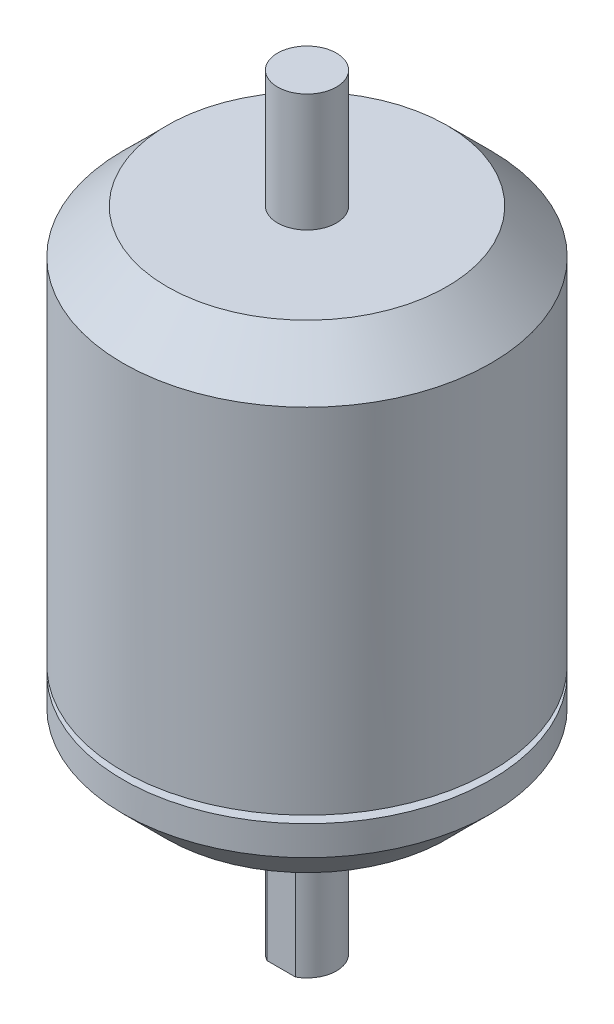
ISO-10303-21;
HEADER;
FILE_DESCRIPTION(('STEP AP214'),'2;1');
FILE_NAME('part.step','',(''),(''),'','','');
FILE_SCHEMA(('AUTOMOTIVE_DESIGN { 1 0 10303 214 1 1 1 1 }'));
ENDSEC;
DATA;
#1=APPLICATION_CONTEXT('core data for automotive mechanical design processes');
#2=APPLICATION_PROTOCOL_DEFINITION('international standard','automotive_design',2000,#1);
#3=PRODUCT_CONTEXT('',#1,'mechanical');
#4=PRODUCT('Part','Part','',(#3));
#5=PRODUCT_RELATED_PRODUCT_CATEGORY('part','',(#4));
#6=PRODUCT_DEFINITION_FORMATION('','',#4);
#7=PRODUCT_DEFINITION_CONTEXT('part definition',#1,'design');
#8=PRODUCT_DEFINITION('design','',#6,#7);
#9=PRODUCT_DEFINITION_SHAPE('','',#8);
#10=(LENGTH_UNIT() NAMED_UNIT(*) SI_UNIT(.MILLI.,.METRE.));
#11=(NAMED_UNIT(*) PLANE_ANGLE_UNIT() SI_UNIT($,.RADIAN.));
#12=(NAMED_UNIT(*) SI_UNIT($,.STERADIAN.) SOLID_ANGLE_UNIT());
#13=UNCERTAINTY_MEASURE_WITH_UNIT(LENGTH_MEASURE(1.E-05),#10,'distance_accuracy_value','');
#14=(GEOMETRIC_REPRESENTATION_CONTEXT(3) GLOBAL_UNCERTAINTY_ASSIGNED_CONTEXT((#13)) GLOBAL_UNIT_ASSIGNED_CONTEXT((#10,
#11,#12)) REPRESENTATION_CONTEXT('',''));
#15=CARTESIAN_POINT('',(0.,0.,0.));
#16=DIRECTION('',(0.,0.,1.));
#17=DIRECTION('',(1.,0.,0.));
#18=AXIS2_PLACEMENT_3D('',#15,#16,#17);
#19=CARTESIAN_POINT('',(0.,65.,0.));
#20=DIRECTION('',(0.,-1.,0.));
#21=DIRECTION('',(0.,0.,-1.));
#22=AXIS2_PLACEMENT_3D('',#19,#20,#21);
#23=CYLINDRICAL_SURFACE('',#22,25.);
#24=CARTESIAN_POINT('',(0.,59.,0.));
#25=DIRECTION('',(0.,1.,0.));
#26=DIRECTION('',(0.,0.,1.));
#27=AXIS2_PLACEMENT_3D('',#24,#25,#26);
#28=CIRCLE('',#27,25.);
#29=CARTESIAN_POINT('',(0.,59.,25.));
#30=VERTEX_POINT('',#29);
#31=EDGE_CURVE('E90',#30,#30,#28,.F.);
#32=ORIENTED_EDGE('',*,*,#31,.T.);
#33=EDGE_LOOP('',(#32));
#34=FACE_BOUND('',#33,.T.);
#35=CARTESIAN_POINT('',(0.,11.,0.));
#36=DIRECTION('',(0.,-1.,0.));
#37=DIRECTION('',(0.,0.,-1.));
#38=AXIS2_PLACEMENT_3D('',#35,#36,#37);
#39=CIRCLE('',#38,25.);
#40=CARTESIAN_POINT('',(0.,11.,-25.));
#41=VERTEX_POINT('',#40);
#42=EDGE_CURVE('E115',#41,#41,#39,.T.);
#43=ORIENTED_EDGE('',*,*,#42,.F.);
#44=EDGE_LOOP('',(#43));
#45=FACE_BOUND('',#44,.T.);
#46=ADVANCED_FACE('F39',(#34,#45),#23,.T.);
#47=CARTESIAN_POINT('',(0.,65.,0.));
#48=DIRECTION('',(0.,1.,0.));
#49=DIRECTION('',(0.,0.,1.));
#50=AXIS2_PLACEMENT_3D('',#47,#48,#49);
#51=PLANE('',#50);
#52=CARTESIAN_POINT('',(0.,65.,0.));
#53=DIRECTION('',(0.,1.,0.));
#54=DIRECTION('',(0.,0.,1.));
#55=AXIS2_PLACEMENT_3D('',#52,#53,#54);
#56=CIRCLE('',#55,4.);
#57=CARTESIAN_POINT('',(0.,65.,4.));
#58=VERTEX_POINT('',#57);
#59=EDGE_CURVE('E49',#58,#58,#56,.T.);
#60=ORIENTED_EDGE('',*,*,#59,.F.);
#61=EDGE_LOOP('',(#60));
#62=FACE_BOUND('',#61,.T.);
#63=CARTESIAN_POINT('',(0.,65.,0.));
#64=DIRECTION('',(0.,1.,0.));
#65=DIRECTION('',(0.,0.,1.));
#66=AXIS2_PLACEMENT_3D('',#63,#64,#65);
#67=CIRCLE('',#66,19.);
#68=CARTESIAN_POINT('',(0.,65.,19.));
#69=VERTEX_POINT('',#68);
#70=EDGE_CURVE('E97',#69,#69,#67,.T.);
#71=ORIENTED_EDGE('',*,*,#70,.T.);
#72=EDGE_LOOP('',(#71));
#73=FACE_BOUND('',#72,.T.);
#74=ADVANCED_FACE('F206',(#62,#73),#51,.T.);
#75=CARTESIAN_POINT('',(0.,65.,0.));
#76=DIRECTION('',(0.,-1.,0.));
#77=DIRECTION('',(0.,0.,-1.));
#78=AXIS2_PLACEMENT_3D('',#75,#76,#77);
#79=CONICAL_SURFACE('',#78,19.,0.785398163397445);
#80=ORIENTED_EDGE('',*,*,#31,.F.);
#81=EDGE_LOOP('',(#80));
#82=FACE_BOUND('',#81,.T.);
#83=ORIENTED_EDGE('',*,*,#70,.F.);
#84=EDGE_LOOP('',(#83));
#85=FACE_BOUND('',#84,.T.);
#86=ADVANCED_FACE('F41',(#82,#85),#79,.T.);
#87=CARTESIAN_POINT('',(0.,81.,0.));
#88=DIRECTION('',(0.,-1.,0.));
#89=DIRECTION('',(0.,0.,-1.));
#90=AXIS2_PLACEMENT_3D('',#87,#88,#89);
#91=CYLINDRICAL_SURFACE('',#90,4.);
#92=CARTESIAN_POINT('',(0.,81.,0.));
#93=DIRECTION('',(0.,1.,0.));
#94=DIRECTION('',(0.,0.,1.));
#95=AXIS2_PLACEMENT_3D('',#92,#93,#94);
#96=CIRCLE('',#95,4.);
#97=CARTESIAN_POINT('',(0.,81.,4.));
#98=VERTEX_POINT('',#97);
#99=EDGE_CURVE('E86',#98,#98,#96,.T.);
#100=ORIENTED_EDGE('',*,*,#99,.F.);
#101=EDGE_LOOP('',(#100));
#102=FACE_BOUND('',#101,.T.);
#103=ORIENTED_EDGE('',*,*,#59,.T.);
#104=EDGE_LOOP('',(#103));
#105=FACE_BOUND('',#104,.T.);
#106=ADVANCED_FACE('F264',(#102,#105),#91,.T.);
#107=CARTESIAN_POINT('',(0.,81.,0.));
#108=DIRECTION('',(0.,1.,0.));
#109=DIRECTION('',(0.,0.,1.));
#110=AXIS2_PLACEMENT_3D('',#107,#108,#109);
#111=PLANE('',#110);
#112=ORIENTED_EDGE('',*,*,#99,.T.);
#113=EDGE_LOOP('',(#112));
#114=FACE_BOUND('',#113,.T.);
#115=ADVANCED_FACE('F261',(#114),#111,.T.);
#116=CARTESIAN_POINT('',(0.,11.,0.));
#117=DIRECTION('',(0.,-1.,0.));
#118=DIRECTION('',(0.,0.,-1.));
#119=AXIS2_PLACEMENT_3D('',#116,#117,#118);
#120=PLANE('',#119);
#121=CARTESIAN_POINT('',(0.,11.,0.));
#122=DIRECTION('',(0.,-1.,0.));
#123=DIRECTION('',(0.,0.,-1.));
#124=AXIS2_PLACEMENT_3D('',#121,#122,#123);
#125=CIRCLE('',#124,10.);
#126=CARTESIAN_POINT('',(0.,11.,-10.));
#127=VERTEX_POINT('',#126);
#128=EDGE_CURVE('E130',#127,#127,#125,.T.);
#129=ORIENTED_EDGE('',*,*,#128,.F.);
#130=EDGE_LOOP('',(#129));
#131=FACE_BOUND('',#130,.T.);
#132=ORIENTED_EDGE('',*,*,#42,.T.);
#133=EDGE_LOOP('',(#132));
#134=FACE_BOUND('',#133,.T.);
#135=CARTESIAN_POINT('',(-15.,11.,0.));
#136=DIRECTION('',(0.,-1.,0.));
#137=DIRECTION('',(0.,0.,-1.));
#138=AXIS2_PLACEMENT_3D('',#135,#136,#137);
#139=CIRCLE('',#138,2.);
#140=CARTESIAN_POINT('',(-15.,11.,-2.));
#141=VERTEX_POINT('',#140);
#142=EDGE_CURVE('E43',#141,#141,#139,.F.);
#143=ORIENTED_EDGE('',*,*,#142,.T.);
#144=EDGE_LOOP('',(#143));
#145=FACE_BOUND('',#144,.T.);
#146=CARTESIAN_POINT('',(0.,11.,15.));
#147=DIRECTION('',(0.,-1.,0.));
#148=DIRECTION('',(0.,0.,-1.));
#149=AXIS2_PLACEMENT_3D('',#146,#147,#148);
#150=CIRCLE('',#149,2.);
#151=CARTESIAN_POINT('',(0.,11.,13.));
#152=VERTEX_POINT('',#151);
#153=EDGE_CURVE('E143',#152,#152,#150,.F.);
#154=ORIENTED_EDGE('',*,*,#153,.T.);
#155=EDGE_LOOP('',(#154));
#156=FACE_BOUND('',#155,.T.);
#157=CARTESIAN_POINT('',(15.,11.,-1.04744440165294E-13));
#158=DIRECTION('',(0.,-1.,0.));
#159=DIRECTION('',(0.,0.,-1.));
#160=AXIS2_PLACEMENT_3D('',#157,#158,#159);
#161=CIRCLE('',#160,2.);
#162=CARTESIAN_POINT('',(15.,11.,-2.00000000000011));
#163=VERTEX_POINT('',#162);
#164=EDGE_CURVE('E147',#163,#163,#161,.F.);
#165=ORIENTED_EDGE('',*,*,#164,.T.);
#166=EDGE_LOOP('',(#165));
#167=FACE_BOUND('',#166,.T.);
#168=CARTESIAN_POINT('',(-1.57116660247941E-13,11.,-15.));
#169=DIRECTION('',(0.,-1.,0.));
#170=DIRECTION('',(0.,0.,-1.));
#171=AXIS2_PLACEMENT_3D('',#168,#169,#170);
#172=CIRCLE('',#171,2.);
#173=CARTESIAN_POINT('',(-1.57116660247941E-13,11.,-17.));
#174=VERTEX_POINT('',#173);
#175=EDGE_CURVE('E151',#174,#174,#172,.F.);
#176=ORIENTED_EDGE('',*,*,#175,.T.);
#177=EDGE_LOOP('',(#176));
#178=FACE_BOUND('',#177,.T.);
#179=ADVANCED_FACE('F234',(#131,#134,#145,#156,#167,#178),#120,.T.);
#180=CARTESIAN_POINT('',(0.,10.,0.));
#181=DIRECTION('',(0.,-1.,0.));
#182=DIRECTION('',(0.,0.,-1.));
#183=AXIS2_PLACEMENT_3D('',#180,#181,#182);
#184=PLANE('',#183);
#185=CARTESIAN_POINT('',(15.,10.,-1.04744440165294E-13));
#186=DIRECTION('',(0.,-1.,0.));
#187=DIRECTION('',(0.,0.,-1.));
#188=AXIS2_PLACEMENT_3D('',#185,#186,#187);
#189=CIRCLE('',#188,2.);
#190=CARTESIAN_POINT('',(15.,10.,-2.00000000000011));
#191=VERTEX_POINT('',#190);
#192=EDGE_CURVE('E121',#191,#191,#189,.F.);
#193=ORIENTED_EDGE('',*,*,#192,.F.);
#194=EDGE_LOOP('',(#193));
#195=FACE_BOUND('',#194,.T.);
#196=CARTESIAN_POINT('',(-15.,10.,0.));
#197=DIRECTION('',(0.,-1.,0.));
#198=DIRECTION('',(0.,0.,-1.));
#199=AXIS2_PLACEMENT_3D('',#196,#197,#198);
#200=CIRCLE('',#199,2.);
#201=CARTESIAN_POINT('',(-15.,10.,-2.));
#202=VERTEX_POINT('',#201);
#203=EDGE_CURVE('E111',#202,#202,#200,.F.);
#204=ORIENTED_EDGE('',*,*,#203,.F.);
#205=EDGE_LOOP('',(#204));
#206=FACE_BOUND('',#205,.T.);
#207=CARTESIAN_POINT('',(0.,10.,0.));
#208=DIRECTION('',(0.,-1.,0.));
#209=DIRECTION('',(0.,0.,-1.));
#210=AXIS2_PLACEMENT_3D('',#207,#208,#209);
#211=CIRCLE('',#210,10.);
#212=CARTESIAN_POINT('',(0.,10.,-10.));
#213=VERTEX_POINT('',#212);
#214=EDGE_CURVE('E133',#213,#213,#211,.T.);
#215=ORIENTED_EDGE('',*,*,#214,.T.);
#216=EDGE_LOOP('',(#215));
#217=FACE_BOUND('',#216,.T.);
#218=CARTESIAN_POINT('',(0.,10.,0.));
#219=DIRECTION('',(0.,-1.,0.));
#220=DIRECTION('',(0.,0.,-1.));
#221=AXIS2_PLACEMENT_3D('',#218,#219,#220);
#222=CIRCLE('',#221,25.);
#223=CARTESIAN_POINT('',(0.,10.,-25.));
#224=VERTEX_POINT('',#223);
#225=EDGE_CURVE('E124',#224,#224,#222,.T.);
#226=ORIENTED_EDGE('',*,*,#225,.F.);
#227=EDGE_LOOP('',(#226));
#228=FACE_BOUND('',#227,.T.);
#229=CARTESIAN_POINT('',(0.,10.,15.));
#230=DIRECTION('',(0.,-1.,0.));
#231=DIRECTION('',(0.,0.,-1.));
#232=AXIS2_PLACEMENT_3D('',#229,#230,#231);
#233=CIRCLE('',#232,2.);
#234=CARTESIAN_POINT('',(0.,10.,13.));
#235=VERTEX_POINT('',#234);
#236=EDGE_CURVE('E114',#235,#235,#233,.F.);
#237=ORIENTED_EDGE('',*,*,#236,.F.);
#238=EDGE_LOOP('',(#237));
#239=FACE_BOUND('',#238,.T.);
#240=CARTESIAN_POINT('',(-1.57116660247941E-13,10.,-15.));
#241=DIRECTION('',(0.,-1.,0.));
#242=DIRECTION('',(0.,0.,-1.));
#243=AXIS2_PLACEMENT_3D('',#240,#241,#242);
#244=CIRCLE('',#243,2.);
#245=CARTESIAN_POINT('',(-1.57116660247941E-13,10.,-17.));
#246=VERTEX_POINT('',#245);
#247=EDGE_CURVE('E139',#246,#246,#244,.F.);
#248=ORIENTED_EDGE('',*,*,#247,.F.);
#249=EDGE_LOOP('',(#248));
#250=FACE_BOUND('',#249,.T.);
#251=ADVANCED_FACE('F230',(#195,#206,#217,#228,#239,#250),#184,.F.);
#252=CARTESIAN_POINT('',(0.,11.,0.));
#253=DIRECTION('',(0.,-1.,0.));
#254=DIRECTION('',(0.,0.,-1.));
#255=AXIS2_PLACEMENT_3D('',#252,#253,#254);
#256=CYLINDRICAL_SURFACE('',#255,10.);
#257=ORIENTED_EDGE('',*,*,#128,.T.);
#258=EDGE_LOOP('',(#257));
#259=FACE_BOUND('',#258,.T.);
#260=ORIENTED_EDGE('',*,*,#214,.F.);
#261=EDGE_LOOP('',(#260));
#262=FACE_BOUND('',#261,.T.);
#263=ADVANCED_FACE('F233',(#259,#262),#256,.T.);
#264=CARTESIAN_POINT('',(-15.,20.,0.));
#265=DIRECTION('',(0.,-1.,0.));
#266=DIRECTION('',(0.,0.,-1.));
#267=AXIS2_PLACEMENT_3D('',#264,#265,#266);
#268=PLANE('',#267);
#269=CARTESIAN_POINT('',(-15.,20.,0.));
#270=DIRECTION('',(0.,-1.,0.));
#271=DIRECTION('',(0.,0.,-1.));
#272=AXIS2_PLACEMENT_3D('',#269,#270,#271);
#273=CIRCLE('',#272,2.);
#274=CARTESIAN_POINT('',(-15.,20.,-2.));
#275=VERTEX_POINT('',#274);
#276=EDGE_CURVE('E75',#275,#275,#273,.T.);
#277=ORIENTED_EDGE('',*,*,#276,.T.);
#278=EDGE_LOOP('',(#277));
#279=FACE_BOUND('',#278,.T.);
#280=ADVANCED_FACE('F371',(#279),#268,.T.);
#281=CARTESIAN_POINT('',(-15.,20.,0.));
#282=DIRECTION('',(0.,-1.,0.));
#283=DIRECTION('',(0.,0.,-1.));
#284=AXIS2_PLACEMENT_3D('',#281,#282,#283);
#285=CYLINDRICAL_SURFACE('',#284,2.);
#286=ORIENTED_EDGE('',*,*,#276,.F.);
#287=EDGE_LOOP('',(#286));
#288=FACE_BOUND('',#287,.T.);
#289=ORIENTED_EDGE('',*,*,#142,.F.);
#290=EDGE_LOOP('',(#289));
#291=FACE_BOUND('',#290,.T.);
#292=ADVANCED_FACE('F363',(#288,#291),#285,.F.);
#293=CARTESIAN_POINT('',(0.,20.,15.));
#294=DIRECTION('',(0.,-1.,0.));
#295=DIRECTION('',(0.,0.,-1.));
#296=AXIS2_PLACEMENT_3D('',#293,#294,#295);
#297=PLANE('',#296);
#298=CARTESIAN_POINT('',(0.,20.,15.));
#299=DIRECTION('',(0.,-1.,0.));
#300=DIRECTION('',(0.,0.,-1.));
#301=AXIS2_PLACEMENT_3D('',#298,#299,#300);
#302=CIRCLE('',#301,2.);
#303=CARTESIAN_POINT('',(0.,20.,13.));
#304=VERTEX_POINT('',#303);
#305=EDGE_CURVE('E163',#304,#304,#302,.T.);
#306=ORIENTED_EDGE('',*,*,#305,.T.);
#307=EDGE_LOOP('',(#306));
#308=FACE_BOUND('',#307,.T.);
#309=ADVANCED_FACE('F358',(#308),#297,.T.);
#310=CARTESIAN_POINT('',(0.,20.,15.));
#311=DIRECTION('',(0.,-1.,0.));
#312=DIRECTION('',(0.,0.,-1.));
#313=AXIS2_PLACEMENT_3D('',#310,#311,#312);
#314=CYLINDRICAL_SURFACE('',#313,2.);
#315=ORIENTED_EDGE('',*,*,#305,.F.);
#316=EDGE_LOOP('',(#315));
#317=FACE_BOUND('',#316,.T.);
#318=ORIENTED_EDGE('',*,*,#153,.F.);
#319=EDGE_LOOP('',(#318));
#320=FACE_BOUND('',#319,.T.);
#321=ADVANCED_FACE('F350',(#317,#320),#314,.F.);
#322=CARTESIAN_POINT('',(15.,20.,-1.04744440165294E-13));
#323=DIRECTION('',(0.,-1.,0.));
#324=DIRECTION('',(0.,0.,-1.));
#325=AXIS2_PLACEMENT_3D('',#322,#323,#324);
#326=PLANE('',#325);
#327=CARTESIAN_POINT('',(15.,20.,-1.04744440165294E-13));
#328=DIRECTION('',(0.,-1.,0.));
#329=DIRECTION('',(0.,0.,-1.));
#330=AXIS2_PLACEMENT_3D('',#327,#328,#329);
#331=CIRCLE('',#330,2.);
#332=CARTESIAN_POINT('',(15.,20.,-2.00000000000011));
#333=VERTEX_POINT('',#332);
#334=EDGE_CURVE('E171',#333,#333,#331,.T.);
#335=ORIENTED_EDGE('',*,*,#334,.T.);
#336=EDGE_LOOP('',(#335));
#337=FACE_BOUND('',#336,.T.);
#338=ADVANCED_FACE('F345',(#337),#326,.T.);
#339=CARTESIAN_POINT('',(15.,20.,-1.04744440165294E-13));
#340=DIRECTION('',(0.,-1.,0.));
#341=DIRECTION('',(0.,0.,-1.));
#342=AXIS2_PLACEMENT_3D('',#339,#340,#341);
#343=CYLINDRICAL_SURFACE('',#342,2.);
#344=ORIENTED_EDGE('',*,*,#334,.F.);
#345=EDGE_LOOP('',(#344));
#346=FACE_BOUND('',#345,.T.);
#347=ORIENTED_EDGE('',*,*,#164,.F.);
#348=EDGE_LOOP('',(#347));
#349=FACE_BOUND('',#348,.T.);
#350=ADVANCED_FACE('F337',(#346,#349),#343,.F.);
#351=CARTESIAN_POINT('',(-1.57116660247941E-13,20.,-15.));
#352=DIRECTION('',(0.,-1.,0.));
#353=DIRECTION('',(0.,0.,-1.));
#354=AXIS2_PLACEMENT_3D('',#351,#352,#353);
#355=PLANE('',#354);
#356=CARTESIAN_POINT('',(-1.57116660247941E-13,20.,-15.));
#357=DIRECTION('',(0.,-1.,0.));
#358=DIRECTION('',(0.,0.,-1.));
#359=AXIS2_PLACEMENT_3D('',#356,#357,#358);
#360=CIRCLE('',#359,2.);
#361=CARTESIAN_POINT('',(-1.57116660247941E-13,20.,-17.));
#362=VERTEX_POINT('',#361);
#363=EDGE_CURVE('E179',#362,#362,#360,.T.);
#364=ORIENTED_EDGE('',*,*,#363,.T.);
#365=EDGE_LOOP('',(#364));
#366=FACE_BOUND('',#365,.T.);
#367=ADVANCED_FACE('F201',(#366),#355,.T.);
#368=CARTESIAN_POINT('',(-1.57116660247941E-13,20.,-15.));
#369=DIRECTION('',(0.,-1.,0.));
#370=DIRECTION('',(0.,0.,-1.));
#371=AXIS2_PLACEMENT_3D('',#368,#369,#370);
#372=CYLINDRICAL_SURFACE('',#371,2.);
#373=ORIENTED_EDGE('',*,*,#363,.F.);
#374=EDGE_LOOP('',(#373));
#375=FACE_BOUND('',#374,.T.);
#376=ORIENTED_EDGE('',*,*,#175,.F.);
#377=EDGE_LOOP('',(#376));
#378=FACE_BOUND('',#377,.T.);
#379=ADVANCED_FACE('F194',(#375,#378),#372,.F.);
#380=CARTESIAN_POINT('',(0.,-3.,0.));
#381=DIRECTION('',(0.,1.,0.));
#382=DIRECTION('',(0.,0.,1.));
#383=AXIS2_PLACEMENT_3D('',#380,#381,#382);
#384=PLANE('',#383);
#385=CARTESIAN_POINT('',(0.,-3.,0.));
#386=DIRECTION('',(0.,-1.,0.));
#387=DIRECTION('',(0.,0.,1.));
#388=AXIS2_PLACEMENT_3D('',#385,#386,#387);
#389=CIRCLE('',#388,4.00000000000001);
#390=CARTESIAN_POINT('',(1.93649167310371,-3.,3.5));
#391=VERTEX_POINT('',#390);
#392=CARTESIAN_POINT('',(-1.93649167310371,-3.,3.5));
#393=VERTEX_POINT('',#392);
#394=EDGE_CURVE('E74',#391,#393,#389,.T.);
#395=ORIENTED_EDGE('',*,*,#394,.T.);
#396=DIRECTION('',(1.,0.,0.));
#397=VECTOR('',#396,1.);
#398=CARTESIAN_POINT('',(-1.93649167310371,-3.,3.5));
#399=LINE('',#398,#397);
#400=EDGE_CURVE('E188',#393,#391,#399,.T.);
#401=ORIENTED_EDGE('',*,*,#400,.T.);
#402=EDGE_LOOP('',(#395,#401));
#403=FACE_BOUND('',#402,.T.);
#404=ADVANCED_FACE('F192',(#403),#384,.F.);
#405=CARTESIAN_POINT('',(-1.93649167310371,-3.,3.5));
#406=DIRECTION('',(0.,0.,-1.));
#407=DIRECTION('',(-1.,0.,0.));
#408=AXIS2_PLACEMENT_3D('',#405,#406,#407);
#409=PLANE('',#408);
#410=DIRECTION('',(1.,0.,0.));
#411=VECTOR('',#410,1.);
#412=CARTESIAN_POINT('',(-1.93649167310371,-23.,3.5));
#413=LINE('',#412,#411);
#414=CARTESIAN_POINT('',(-1.93649167310371,-23.,3.5));
#415=VERTEX_POINT('',#414);
#416=CARTESIAN_POINT('',(1.93649167310371,-23.,3.5));
#417=VERTEX_POINT('',#416);
#418=EDGE_CURVE('E68',#415,#417,#413,.T.);
#419=ORIENTED_EDGE('',*,*,#418,.T.);
#420=DIRECTION('',(0.,-1.,0.));
#421=VECTOR('',#420,1.);
#422=CARTESIAN_POINT('',(1.93649167310371,-3.,3.5));
#423=LINE('',#422,#421);
#424=EDGE_CURVE('E63',#391,#417,#423,.T.);
#425=ORIENTED_EDGE('',*,*,#424,.F.);
#426=ORIENTED_EDGE('',*,*,#400,.F.);
#427=DIRECTION('',(0.,-1.,0.));
#428=VECTOR('',#427,1.);
#429=CARTESIAN_POINT('',(-1.93649167310371,-3.,3.5));
#430=LINE('',#429,#428);
#431=EDGE_CURVE('E57',#393,#415,#430,.T.);
#432=ORIENTED_EDGE('',*,*,#431,.T.);
#433=EDGE_LOOP('',(#419,#425,#426,#432));
#434=FACE_BOUND('',#433,.T.);
#435=ADVANCED_FACE('F69',(#434),#409,.F.);
#436=CARTESIAN_POINT('',(0.,-23.,0.));
#437=DIRECTION('',(0.,-1.,0.));
#438=DIRECTION('',(0.,0.,-1.));
#439=AXIS2_PLACEMENT_3D('',#436,#437,#438);
#440=PLANE('',#439);
#441=ORIENTED_EDGE('',*,*,#418,.F.);
#442=CARTESIAN_POINT('',(0.,-23.,0.));
#443=DIRECTION('',(0.,-1.,0.));
#444=DIRECTION('',(0.,0.,-1.));
#445=AXIS2_PLACEMENT_3D('',#442,#443,#444);
#446=CIRCLE('',#445,4.);
#447=EDGE_CURVE('E81',#415,#417,#446,.T.);
#448=ORIENTED_EDGE('',*,*,#447,.T.);
#449=EDGE_LOOP('',(#441,#448));
#450=FACE_BOUND('',#449,.T.);
#451=ADVANCED_FACE('F84',(#450),#440,.T.);
#452=CARTESIAN_POINT('',(0.,-23.,0.));
#453=DIRECTION('',(0.,1.,0.));
#454=DIRECTION('',(0.,0.,1.));
#455=AXIS2_PLACEMENT_3D('',#452,#453,#454);
#456=CYLINDRICAL_SURFACE('',#455,4.);
#457=ORIENTED_EDGE('',*,*,#447,.F.);
#458=ORIENTED_EDGE('',*,*,#431,.F.);
#459=ORIENTED_EDGE('',*,*,#394,.F.);
#460=ORIENTED_EDGE('',*,*,#424,.T.);
#461=EDGE_LOOP('',(#457,#458,#459,#460));
#462=FACE_BOUND('',#461,.T.);
#463=CARTESIAN_POINT('',(0.,0.,0.));
#464=DIRECTION('',(0.,-1.,0.));
#465=DIRECTION('',(0.,0.,-1.));
#466=AXIS2_PLACEMENT_3D('',#463,#464,#465);
#467=CIRCLE('',#466,4.);
#468=CARTESIAN_POINT('',(0.,0.,-4.));
#469=VERTEX_POINT('',#468);
#470=EDGE_CURVE('E11',#469,#469,#467,.T.);
#471=ORIENTED_EDGE('',*,*,#470,.T.);
#472=EDGE_LOOP('',(#471));
#473=FACE_BOUND('',#472,.T.);
#474=ADVANCED_FACE('F79',(#462,#473),#456,.T.);
#475=ORIENTED_EDGE('',*,*,#247,.T.);
#476=EDGE_LOOP('',(#475));
#477=FACE_BOUND('',#476,.T.);
#478=CARTESIAN_POINT('',(-1.57116660247941E-13,0.,-15.));
#479=DIRECTION('',(0.,-1.,0.));
#480=DIRECTION('',(0.,0.,-1.));
#481=AXIS2_PLACEMENT_3D('',#478,#479,#480);
#482=CIRCLE('',#481,2.);
#483=CARTESIAN_POINT('',(-1.57116660247941E-13,0.,-17.));
#484=VERTEX_POINT('',#483);
#485=EDGE_CURVE('E155',#484,#484,#482,.T.);
#486=ORIENTED_EDGE('',*,*,#485,.T.);
#487=EDGE_LOOP('',(#486));
#488=FACE_BOUND('',#487,.T.);
#489=ADVANCED_FACE('F204',(#477,#488),#372,.F.);
#490=ORIENTED_EDGE('',*,*,#192,.T.);
#491=EDGE_LOOP('',(#490));
#492=FACE_BOUND('',#491,.T.);
#493=CARTESIAN_POINT('',(15.,0.,-1.04744440165294E-13));
#494=DIRECTION('',(0.,-1.,0.));
#495=DIRECTION('',(0.,0.,-1.));
#496=AXIS2_PLACEMENT_3D('',#493,#494,#495);
#497=CIRCLE('',#496,2.);
#498=CARTESIAN_POINT('',(15.,0.,-2.00000000000011));
#499=VERTEX_POINT('',#498);
#500=EDGE_CURVE('E175',#499,#499,#497,.T.);
#501=ORIENTED_EDGE('',*,*,#500,.T.);
#502=EDGE_LOOP('',(#501));
#503=FACE_BOUND('',#502,.T.);
#504=ADVANCED_FACE('F243',(#492,#503),#343,.F.);
#505=ORIENTED_EDGE('',*,*,#236,.T.);
#506=EDGE_LOOP('',(#505));
#507=FACE_BOUND('',#506,.T.);
#508=CARTESIAN_POINT('',(0.,0.,15.));
#509=DIRECTION('',(0.,-1.,0.));
#510=DIRECTION('',(0.,0.,-1.));
#511=AXIS2_PLACEMENT_3D('',#508,#509,#510);
#512=CIRCLE('',#511,2.);
#513=CARTESIAN_POINT('',(0.,0.,13.));
#514=VERTEX_POINT('',#513);
#515=EDGE_CURVE('E167',#514,#514,#512,.T.);
#516=ORIENTED_EDGE('',*,*,#515,.T.);
#517=EDGE_LOOP('',(#516));
#518=FACE_BOUND('',#517,.T.);
#519=ADVANCED_FACE('F249',(#507,#518),#314,.F.);
#520=CARTESIAN_POINT('',(0.,0.,0.));
#521=DIRECTION('',(0.,1.,0.));
#522=DIRECTION('',(0.,0.,1.));
#523=AXIS2_PLACEMENT_3D('',#520,#521,#522);
#524=PLANE('',#523);
#525=CARTESIAN_POINT('',(-15.,0.,0.));
#526=DIRECTION('',(0.,-1.,0.));
#527=DIRECTION('',(0.,0.,-1.));
#528=AXIS2_PLACEMENT_3D('',#525,#526,#527);
#529=CIRCLE('',#528,2.);
#530=CARTESIAN_POINT('',(-15.,0.,-2.));
#531=VERTEX_POINT('',#530);
#532=EDGE_CURVE('E159',#531,#531,#529,.T.);
#533=ORIENTED_EDGE('',*,*,#532,.F.);
#534=EDGE_LOOP('',(#533));
#535=FACE_BOUND('',#534,.T.);
#536=ORIENTED_EDGE('',*,*,#515,.F.);
#537=EDGE_LOOP('',(#536));
#538=FACE_BOUND('',#537,.T.);
#539=ORIENTED_EDGE('',*,*,#500,.F.);
#540=EDGE_LOOP('',(#539));
#541=FACE_BOUND('',#540,.T.);
#542=ORIENTED_EDGE('',*,*,#485,.F.);
#543=EDGE_LOOP('',(#542));
#544=FACE_BOUND('',#543,.T.);
#545=ORIENTED_EDGE('',*,*,#470,.F.);
#546=EDGE_LOOP('',(#545));
#547=FACE_BOUND('',#546,.T.);
#548=CARTESIAN_POINT('',(0.,0.,0.));
#549=DIRECTION('',(0.,1.,0.));
#550=DIRECTION('',(0.,0.,1.));
#551=AXIS2_PLACEMENT_3D('',#548,#549,#550);
#552=CIRCLE('',#551,19.);
#553=CARTESIAN_POINT('',(0.,0.,19.));
#554=VERTEX_POINT('',#553);
#555=EDGE_CURVE('E105',#554,#554,#552,.F.);
#556=ORIENTED_EDGE('',*,*,#555,.T.);
#557=EDGE_LOOP('',(#556));
#558=FACE_BOUND('',#557,.T.);
#559=ADVANCED_FACE('F246',(#535,#538,#541,#544,#547,#558),#524,.F.);
#560=ORIENTED_EDGE('',*,*,#203,.T.);
#561=EDGE_LOOP('',(#560));
#562=FACE_BOUND('',#561,.T.);
#563=ORIENTED_EDGE('',*,*,#532,.T.);
#564=EDGE_LOOP('',(#563));
#565=FACE_BOUND('',#564,.T.);
#566=ADVANCED_FACE('F223',(#562,#565),#285,.F.);
#567=CARTESIAN_POINT('',(0.,6.00000000000001,0.));
#568=DIRECTION('',(0.,1.,0.));
#569=DIRECTION('',(0.,0.,1.));
#570=AXIS2_PLACEMENT_3D('',#567,#568,#569);
#571=CONICAL_SURFACE('',#570,25.,0.785398163397451);
#572=ORIENTED_EDGE('',*,*,#555,.F.);
#573=EDGE_LOOP('',(#572));
#574=FACE_BOUND('',#573,.T.);
#575=CARTESIAN_POINT('',(0.,6.00000000000001,0.));
#576=DIRECTION('',(0.,1.,0.));
#577=DIRECTION('',(0.,0.,1.));
#578=AXIS2_PLACEMENT_3D('',#575,#576,#577);
#579=CIRCLE('',#578,25.);
#580=CARTESIAN_POINT('',(0.,6.00000000000001,25.));
#581=VERTEX_POINT('',#580);
#582=EDGE_CURVE('E101',#581,#581,#579,.T.);
#583=ORIENTED_EDGE('',*,*,#582,.F.);
#584=EDGE_LOOP('',(#583));
#585=FACE_BOUND('',#584,.T.);
#586=ADVANCED_FACE('F218',(#574,#585),#571,.T.);
#587=ORIENTED_EDGE('',*,*,#225,.T.);
#588=EDGE_LOOP('',(#587));
#589=FACE_BOUND('',#588,.T.);
#590=ORIENTED_EDGE('',*,*,#582,.T.);
#591=EDGE_LOOP('',(#590));
#592=FACE_BOUND('',#591,.T.);
#593=ADVANCED_FACE('F209',(#589,#592),#23,.T.);
#594=CLOSED_SHELL('',(#46,#74,#86,#106,#115,#179,#251,#263,#280,#292,#309,#321,#338,#350,#367,
#379,#404,#435,#451,#474,#489,#504,#519,#559,#566,#586,#593));
#595=MANIFOLD_SOLID_BREP('B2',#594);
#596=ADVANCED_BREP_SHAPE_REPRESENTATION('',(#18,#595),#14);
#597=SHAPE_DEFINITION_REPRESENTATION(#9,#596);
ENDSEC;
END-ISO-10303-21;
